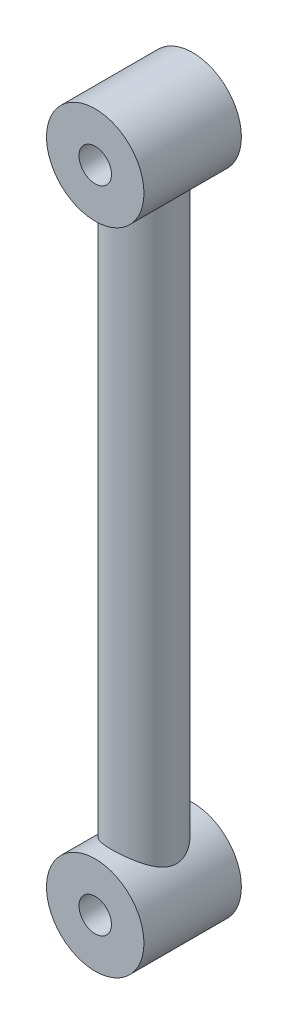
ISO-10303-21;
HEADER;
FILE_DESCRIPTION(('STEP AP214'),'2;1');
FILE_NAME('part.step','',(''),(''),'','','');
FILE_SCHEMA(('AUTOMOTIVE_DESIGN { 1 0 10303 214 1 1 1 1 }'));
ENDSEC;
DATA;
#1=APPLICATION_CONTEXT('core data for automotive mechanical design processes');
#2=APPLICATION_PROTOCOL_DEFINITION('international standard','automotive_design',2000,#1);
#3=PRODUCT_CONTEXT('',#1,'mechanical');
#4=PRODUCT('Part','Part','',(#3));
#5=PRODUCT_RELATED_PRODUCT_CATEGORY('part','',(#4));
#6=PRODUCT_DEFINITION_FORMATION('','',#4);
#7=PRODUCT_DEFINITION_CONTEXT('part definition',#1,'design');
#8=PRODUCT_DEFINITION('design','',#6,#7);
#9=PRODUCT_DEFINITION_SHAPE('','',#8);
#10=(LENGTH_UNIT() NAMED_UNIT(*) SI_UNIT(.MILLI.,.METRE.));
#11=(NAMED_UNIT(*) PLANE_ANGLE_UNIT() SI_UNIT($,.RADIAN.));
#12=(NAMED_UNIT(*) SI_UNIT($,.STERADIAN.) SOLID_ANGLE_UNIT());
#13=UNCERTAINTY_MEASURE_WITH_UNIT(LENGTH_MEASURE(1.E-05),#10,'distance_accuracy_value','');
#14=(GEOMETRIC_REPRESENTATION_CONTEXT(3) GLOBAL_UNCERTAINTY_ASSIGNED_CONTEXT((#13)) GLOBAL_UNIT_ASSIGNED_CONTEXT((#10,
#11,#12)) REPRESENTATION_CONTEXT('',''));
#15=CARTESIAN_POINT('',(0.,0.,0.));
#16=DIRECTION('',(0.,0.,1.));
#17=DIRECTION('',(1.,0.,0.));
#18=AXIS2_PLACEMENT_3D('',#15,#16,#17);
#19=CARTESIAN_POINT('',(0.,0.,3.));
#20=DIRECTION('',(0.,0.,1.));
#21=DIRECTION('',(1.,0.,0.));
#22=AXIS2_PLACEMENT_3D('',#19,#20,#21);
#23=PLANE('',#22);
#24=CARTESIAN_POINT('',(0.,0.,3.));
#25=DIRECTION('',(0.,0.,1.));
#26=DIRECTION('',(1.,0.,0.));
#27=AXIS2_PLACEMENT_3D('',#24,#25,#26);
#28=CIRCLE('',#27,1.5);
#29=CARTESIAN_POINT('',(1.5,0.,3.));
#30=VERTEX_POINT('',#29);
#31=EDGE_CURVE('E10',#30,#30,#28,.T.);
#32=ORIENTED_EDGE('',*,*,#31,.T.);
#33=EDGE_LOOP('',(#32));
#34=FACE_BOUND('',#33,.T.);
#35=CARTESIAN_POINT('',(0.,0.,3.));
#36=DIRECTION('',(0.,0.,1.));
#37=DIRECTION('',(1.,0.,0.));
#38=AXIS2_PLACEMENT_3D('',#35,#36,#37);
#39=CIRCLE('',#38,0.5);
#40=CARTESIAN_POINT('',(0.5,0.,3.));
#41=VERTEX_POINT('',#40);
#42=EDGE_CURVE('E42',#41,#41,#39,.T.);
#43=ORIENTED_EDGE('',*,*,#42,.F.);
#44=EDGE_LOOP('',(#43));
#45=FACE_BOUND('',#44,.T.);
#46=ADVANCED_FACE('F31',(#34,#45),#23,.T.);
#47=CARTESIAN_POINT('',(0.,0.,0.));
#48=DIRECTION('',(0.,0.,1.));
#49=DIRECTION('',(1.,0.,0.));
#50=AXIS2_PLACEMENT_3D('',#47,#48,#49);
#51=PLANE('',#50);
#52=CARTESIAN_POINT('',(0.,0.,0.));
#53=DIRECTION('',(0.,0.,1.));
#54=DIRECTION('',(1.,0.,0.));
#55=AXIS2_PLACEMENT_3D('',#52,#53,#54);
#56=CIRCLE('',#55,1.5);
#57=CARTESIAN_POINT('',(1.5,0.,0.));
#58=VERTEX_POINT('',#57);
#59=EDGE_CURVE('E35',#58,#58,#56,.T.);
#60=ORIENTED_EDGE('',*,*,#59,.F.);
#61=EDGE_LOOP('',(#60));
#62=FACE_BOUND('',#61,.T.);
#63=CARTESIAN_POINT('',(0.,0.,0.));
#64=DIRECTION('',(0.,0.,1.));
#65=DIRECTION('',(1.,0.,0.));
#66=AXIS2_PLACEMENT_3D('',#63,#64,#65);
#67=CIRCLE('',#66,0.5);
#68=CARTESIAN_POINT('',(0.5,0.,0.));
#69=VERTEX_POINT('',#68);
#70=EDGE_CURVE('E44',#69,#69,#67,.T.);
#71=ORIENTED_EDGE('',*,*,#70,.T.);
#72=EDGE_LOOP('',(#71));
#73=FACE_BOUND('',#72,.T.);
#74=ADVANCED_FACE('F89',(#62,#73),#51,.F.);
#75=CARTESIAN_POINT('',(0.,0.,3.));
#76=DIRECTION('',(0.,0.,-1.));
#77=DIRECTION('',(-1.,0.,0.));
#78=AXIS2_PLACEMENT_3D('',#75,#76,#77);
#79=CYLINDRICAL_SURFACE('',#78,1.5);
#80=CARTESIAN_POINT('',(0.,1.5,2.5));
#81=CARTESIAN_POINT('',(0.0502423583340652,1.50000020822414,2.50000027481625));
#82=CARTESIAN_POINT('',(0.100484543566459,1.49745401376693,2.49619301502225));
#83=CARTESIAN_POINT('',(0.199366529015835,1.48752326211906,2.48120156794717));
#84=CARTESIAN_POINT('',(0.248005556977503,1.48013640790618,2.47001387843835));
#85=CARTESIAN_POINT('',(0.342106153927127,1.46125241202354,2.44094614133758));
#86=CARTESIAN_POINT('',(0.387581436328779,1.44977452746657,2.42309742999603));
#87=CARTESIAN_POINT('',(0.47470764549863,1.4236306893872,2.38146831836425));
#88=CARTESIAN_POINT('',(0.516358015804835,1.40896427302755,2.35768705684972));
#89=CARTESIAN_POINT('',(0.598642350385056,1.37613664684919,2.30267153131628));
#90=CARTESIAN_POINT('',(0.638890152730339,1.3577844878966,2.27097606962855));
#91=CARTESIAN_POINT('',(0.71386402234637,1.31991156541733,2.20213497567077));
#92=CARTESIAN_POINT('',(0.74858202771944,1.30038915178416,2.16498153508113));
#93=CARTESIAN_POINT('',(0.817111488727482,1.25864132339397,2.07947381619366));
#94=CARTESIAN_POINT('',(0.849915931813756,1.23647533968899,2.03027717339828));
#95=CARTESIAN_POINT('',(0.906751785070869,1.19542073676408,1.92581831117673));
#96=CARTESIAN_POINT('',(0.930798367132496,1.17652647977327,1.87056679921861));
#97=CARTESIAN_POINT('',(0.963370175057205,1.14988133320735,1.7716443532892));
#98=CARTESIAN_POINT('',(0.974372236180083,1.14048813946218,1.72923577356309));
#99=CARTESIAN_POINT('',(0.990753088926101,1.12628984829786,1.64262774762913));
#100=CARTESIAN_POINT('',(0.996141573259662,1.12147684372013,1.59843152563681));
#101=CARTESIAN_POINT('',(1.00095682070629,1.11718302804083,1.50926261057193));
#102=CARTESIAN_POINT('',(1.0003592145882,1.11772401279478,1.4642874882744));
#103=CARTESIAN_POINT('',(0.993187906666196,1.12409887741485,1.37518251324952));
#104=CARTESIAN_POINT('',(0.986609141899785,1.12993724142592,1.33105340898368));
#105=CARTESIAN_POINT('',(0.968324971088713,1.14563592995791,1.24676647438121));
#106=CARTESIAN_POINT('',(0.956858557405004,1.15530744165153,1.20651933203847));
#107=CARTESIAN_POINT('',(0.929350592909502,1.17754811463845,1.12848815450425));
#108=CARTESIAN_POINT('',(0.913307536614356,1.19011822916388,1.09070493485137));
#109=CARTESIAN_POINT('',(0.87336909369832,1.21982098202212,1.01048730235886));
#110=CARTESIAN_POINT('',(0.848540261643843,1.23736158924507,0.968670049905941));
#111=CARTESIAN_POINT('',(0.79334480233653,1.27345768922483,0.889308302508095));
#112=CARTESIAN_POINT('',(0.762971345040339,1.29201441370946,0.851769171162871));
#113=CARTESIAN_POINT('',(0.689905826559712,1.33271671862095,0.773728727144433));
#114=CARTESIAN_POINT('',(0.6459696914045,1.35477372355024,0.734332975644298));
#115=CARTESIAN_POINT('',(0.55100399955381,1.39609050337857,0.663401752745065));
#116=CARTESIAN_POINT('',(0.499981149675164,1.41535288825285,0.631858927298954));
#117=CARTESIAN_POINT('',(0.402428913545602,1.44572702044166,0.583261140685796));
#118=CARTESIAN_POINT('',(0.356978821685242,1.45769630582498,0.564578318329789));
#119=CARTESIAN_POINT('',(0.263018021968455,1.47753859515521,0.533947537188057));
#120=CARTESIAN_POINT('',(0.214509939501019,1.48541506063844,0.52199388643409));
#121=CARTESIAN_POINT('',(0.115492726585948,1.49637941078331,0.505419417380803));
#122=CARTESIAN_POINT('',(0.0649759059670244,1.49944661230576,0.500830269530819));
#123=CARTESIAN_POINT('',(-0.036220759694616,1.50041557482591,0.499376455718946));
#124=CARTESIAN_POINT('',(-0.0869005930932811,1.49831769692815,0.502511249755611));
#125=CARTESIAN_POINT('',(-0.183227858602146,1.48949794712138,0.515812027780979));
#126=CARTESIAN_POINT('',(-0.228978722339654,1.48311123195135,0.525468648877662));
#127=CARTESIAN_POINT('',(-0.318058196213639,1.46659224642396,0.550797843006378));
#128=CARTESIAN_POINT('',(-0.361386418785354,1.45645937873408,0.5664713754639));
#129=CARTESIAN_POINT('',(-0.447332375233221,1.4324817626467,0.604326148522677));
#130=CARTESIAN_POINT('',(-0.489748092316563,1.41844935068245,0.626844077041761));
#131=CARTESIAN_POINT('',(-0.570341511977789,1.38800927805403,0.677216644972303));
#132=CARTESIAN_POINT('',(-0.608516574097254,1.37160015200651,0.705074580262964));
#133=CARTESIAN_POINT('',(-0.685927227415322,1.33477273328243,0.770303934082368));
#134=CARTESIAN_POINT('',(-0.724375937862664,1.31413078406203,0.808483130052021));
#135=CARTESIAN_POINT('',(-0.794669840332392,1.27285586536854,0.890555714964069));
#136=CARTESIAN_POINT('',(-0.826510468230432,1.25222291185946,0.934453019499398));
#137=CARTESIAN_POINT('',(-0.880623882794762,1.21469839506517,1.0235712064292));
#138=CARTESIAN_POINT('',(-0.903478180804393,1.19763798588662,1.06836601689986));
#139=CARTESIAN_POINT('',(-0.94248106887625,1.16719487207113,1.16193632639057));
#140=CARTESIAN_POINT('',(-0.958641728453857,1.1538055628277,1.21070446919769));
#141=CARTESIAN_POINT('',(-0.981179217293118,1.13466604076532,1.30228224356704));
#142=CARTESIAN_POINT('',(-0.988792987823091,1.12797499006895,1.34458590492947));
#143=CARTESIAN_POINT('',(-0.998496029624886,1.11939733222928,1.43028664066772));
#144=CARTESIAN_POINT('',(-1.00059130142516,1.11750550674066,1.47368247557323));
#145=CARTESIAN_POINT('',(-0.999119609907756,1.11882100574833,1.56032152835836));
#146=CARTESIAN_POINT('',(-0.995549293852655,1.12203134956834,1.60356464068146));
#147=CARTESIAN_POINT('',(-0.98298498610997,1.1330522619864,1.68867176427148));
#148=CARTESIAN_POINT('',(-0.973983758587649,1.14086896751217,1.73053385693038));
#149=CARTESIAN_POINT('',(-0.947965178356308,1.1626342196827,1.82285559321431));
#150=CARTESIAN_POINT('',(-0.929450935941993,1.17766166854602,1.87263385636953));
#151=CARTESIAN_POINT('',(-0.885422631474873,1.21111080629161,1.96774341708941));
#152=CARTESIAN_POINT('',(-0.85989874178542,1.22953724861883,2.01306834896843));
#153=CARTESIAN_POINT('',(-0.801991402694657,1.26808593269726,2.09964094359684));
#154=CARTESIAN_POINT('',(-0.769491549448272,1.2882329369107,2.14079937271925));
#155=CARTESIAN_POINT('',(-0.698358840177309,1.32814150773993,2.21766123912123));
#156=CARTESIAN_POINT('',(-0.659724105134951,1.3479029541764,2.2533629985124));
#157=CARTESIAN_POINT('',(-0.570728664877768,1.38815775980392,2.32335605215706));
#158=CARTESIAN_POINT('',(-0.519480834775987,1.40834902724558,2.35670932008983));
#159=CARTESIAN_POINT('',(-0.41043427788749,1.44388832937518,2.41395663833198));
#160=CARTESIAN_POINT('',(-0.352646031225023,1.45924396722731,2.43786555341182));
#161=CARTESIAN_POINT('',(-0.245717534917525,1.48050822418367,2.47057728908201));
#162=CARTESIAN_POINT('',(-0.197506162628867,1.48775740184446,2.48155551954934));
#163=CARTESIAN_POINT('',(-0.0995290060120646,1.49750140070948,2.49626401626902));
#164=CARTESIAN_POINT('',(-0.0497644180940277,1.49999979375663,2.499999727798));
#165=CARTESIAN_POINT('',(0.,1.5,2.5));
#166=B_SPLINE_CURVE_WITH_KNOTS('',3,(#80,#81,#82,#83,#84,#85,#86,#87,#88,#89,#90,#91,#92,#93,
#94,#95,#96,#97,#98,#99,#100,#101,#102,#103,#104,#105,#106,#107,#108,#109,#110,#111,#112,#113,
#114,#115,#116,#117,#118,#119,#120,#121,#122,#123,#124,#125,#126,#127,#128,#129,#130,#131,#132,
#133,#134,#135,#136,#137,#138,#139,#140,#141,#142,#143,#144,#145,#146,#147,#148,#149,#150,#151,
#152,#153,#154,#155,#156,#157,#158,#159,#160,#161,#162,#163,#164,#165),.UNSPECIFIED.,.T.,.F.,(4,
2,2,2,2,2,2,2,2,2,2,2,2,2,2,2,2,2,2,2,2,2,2,2,2,2,2,2,2,2,2,2,2,2,2,2,2,2,2,2,2,2,4),(0.,
0.1505266132527,0.301124707174344,0.451023076595116,0.600943219336933,0.763585145002784,
0.926462058021593,1.11503341647991,1.30327652722719,1.43716846838015,1.57082883922905,
1.70503355867689,1.83935198631676,1.96774431099011,2.09617891902539,2.25073787329797,
2.40548851889212,2.5935947724756,2.78152420149865,2.93262043847563,3.08358867570591,
3.23520441646309,3.38680955765891,3.5277654239542,3.66874377568319,3.81826173413942,
3.96787227471786,4.1411408806983,4.31452876587063,4.47324967649701,4.63168313315306,
4.76162024003012,4.8914160016149,5.02128860137218,5.15133461921144,5.31603304346011,
5.48096356682587,5.64889622595852,5.81688041978686,6.00897675773025,6.20076953274023,
6.34997645676983,6.49907115623394),.UNSPECIFIED.);
#167=CARTESIAN_POINT('',(0.,1.5,2.5));
#168=VERTEX_POINT('',#167);
#169=EDGE_CURVE('E47',#168,#168,#166,.T.);
#170=ORIENTED_EDGE('',*,*,#169,.F.);
#171=EDGE_LOOP('',(#170));
#172=FACE_BOUND('',#171,.T.);
#173=ORIENTED_EDGE('',*,*,#31,.F.);
#174=EDGE_LOOP('',(#173));
#175=FACE_BOUND('',#174,.T.);
#176=ORIENTED_EDGE('',*,*,#59,.T.);
#177=EDGE_LOOP('',(#176));
#178=FACE_BOUND('',#177,.T.);
#179=ADVANCED_FACE('F33',(#172,#175,#178),#79,.T.);
#180=CARTESIAN_POINT('',(0.,0.,3.));
#181=DIRECTION('',(0.,0.,-1.));
#182=DIRECTION('',(-1.,0.,0.));
#183=AXIS2_PLACEMENT_3D('',#180,#181,#182);
#184=CYLINDRICAL_SURFACE('',#183,0.5);
#185=ORIENTED_EDGE('',*,*,#42,.T.);
#186=EDGE_LOOP('',(#185));
#187=FACE_BOUND('',#186,.T.);
#188=ORIENTED_EDGE('',*,*,#70,.F.);
#189=EDGE_LOOP('',(#188));
#190=FACE_BOUND('',#189,.T.);
#191=ADVANCED_FACE('F96',(#187,#190),#184,.F.);
#192=CARTESIAN_POINT('',(0.,-1.501,1.5));
#193=DIRECTION('',(0.,1.,0.));
#194=DIRECTION('',(0.,0.,1.));
#195=AXIS2_PLACEMENT_3D('',#192,#193,#194);
#196=CYLINDRICAL_SURFACE('',#195,1.);
#197=ORIENTED_EDGE('',*,*,#169,.T.);
#198=EDGE_LOOP('',(#197));
#199=FACE_BOUND('',#198,.T.);
#200=CARTESIAN_POINT('',(1.,18.8819660112501,1.5));
#201=CARTESIAN_POINT('',(0.999997269988655,18.8819612326859,1.45118584456569));
#202=CARTESIAN_POINT('',(0.996394962518321,18.8787096447628,1.4023546231456));
#203=CARTESIAN_POINT('',(0.982291341588656,18.8663401374919,1.30644004417459));
#204=CARTESIAN_POINT('',(0.971777652939313,18.8572116959364,1.25935998223522));
#205=CARTESIAN_POINT('',(0.944679308383161,18.8347170708722,1.16863227906116));
#206=CARTESIAN_POINT('',(0.928153590071071,18.821392191027,1.12495615163117));
#207=CARTESIAN_POINT('',(0.889670041967693,18.7920795265909,1.04106708382667));
#208=CARTESIAN_POINT('',(0.867711084060815,18.7760911892058,1.00085486501176));
#209=CARTESIAN_POINT('',(0.81501205003857,18.7402696353399,0.918176556191546));
#210=CARTESIAN_POINT('',(0.783437177258663,18.7202253195482,0.876333941141402));
#211=CARTESIAN_POINT('',(0.714096098703402,18.6802758634596,0.79799864556286));
#212=CARTESIAN_POINT('',(0.676323865885403,18.6603708785101,0.761511239170737));
#213=CARTESIAN_POINT('',(0.589078452471479,18.6195559073813,0.689678170609168));
#214=CARTESIAN_POINT('',(0.538703219829097,18.5989160707654,0.655258744112164));
#215=CARTESIAN_POINT('',(0.431235482106117,18.5622075775862,0.595678952254963));
#216=CARTESIAN_POINT('',(0.374150576160853,18.5461338188448,0.570508242984405));
#217=CARTESIAN_POINT('',(0.261624536740002,18.5220004626764,0.533221799491273));
#218=CARTESIAN_POINT('',(0.206717362590708,18.5132441219207,0.51995832775222));
#219=CARTESIAN_POINT('',(0.0948477243649314,18.5019512726904,0.502907755358176));
#220=CARTESIAN_POINT('',(0.0378879406429131,18.4994069311882,0.499108720387279));
#221=CARTESIAN_POINT('',(-0.0670735251161643,18.5007231913852,0.501086224974525));
#222=CARTESIAN_POINT('',(-0.115120319004376,18.5036686754494,0.505494525658531));
#223=CARTESIAN_POINT('',(-0.209619316635507,18.5139590860499,0.521045525679454));
#224=CARTESIAN_POINT('',(-0.256071403824861,18.5213043334345,0.532188716151771));
#225=CARTESIAN_POINT('',(-0.346038968835584,18.5397395414813,0.560597842397288));
#226=CARTESIAN_POINT('',(-0.38956531192298,18.5508146100866,0.577839442599278));
#227=CARTESIAN_POINT('',(-0.473104575326777,18.5758944776186,0.617776821476409));
#228=CARTESIAN_POINT('',(-0.513116852484701,18.5898998112742,0.640473595750756));
#229=CARTESIAN_POINT('',(-0.59414214598172,18.6219097077465,0.693989368729946));
#230=CARTESIAN_POINT('',(-0.634595740498538,18.6401979560399,0.725483761676394));
#231=CARTESIAN_POINT('',(-0.709994037491522,18.677996990865,0.793949339740162));
#232=CARTESIAN_POINT('',(-0.744930067597284,18.6975096359238,0.830928972966907));
#233=CARTESIAN_POINT('',(-0.813861176630825,18.7392497752792,0.915981605106644));
#234=CARTESIAN_POINT('',(-0.846867965631775,18.7614283999553,0.964885539857239));
#235=CARTESIAN_POINT('',(-0.904174374727407,18.8026219458445,1.06875491961036));
#236=CARTESIAN_POINT('',(-0.928488593274469,18.8216421423256,1.12370999720697));
#237=CARTESIAN_POINT('',(-0.96166362283889,18.8486856484655,1.22235953103654));
#238=CARTESIAN_POINT('',(-0.972953958737703,18.8582981771115,1.26479668502839));
#239=CARTESIAN_POINT('',(-0.989897777900028,18.8729548010521,1.35151974490846));
#240=CARTESIAN_POINT('',(-0.995561034821824,18.8780068160888,1.39580230558646));
#241=CARTESIAN_POINT('',(-1.00089700074453,18.8827622150626,1.48522149322059));
#242=CARTESIAN_POINT('',(-1.00054364876605,18.8824423306655,1.53036098925948));
#243=CARTESIAN_POINT('',(-0.993808148581261,18.8764505981574,1.6198419169781));
#244=CARTESIAN_POINT('',(-0.987421113449805,18.8707744117639,1.66418267205586));
#245=CARTESIAN_POINT('',(-0.969499055937225,18.8553601124885,1.74869470877286));
#246=CARTESIAN_POINT('',(-0.958230872657145,18.8458340646228,1.78896385449378));
#247=CARTESIAN_POINT('',(-0.931115208135281,18.8238502073602,1.86706311803266));
#248=CARTESIAN_POINT('',(-0.915266188999617,18.8113914136327,1.9048924115095));
#249=CARTESIAN_POINT('',(-0.875816733031261,18.7819425818926,1.98510100188837));
#250=CARTESIAN_POINT('',(-0.851300144226029,18.7645445923118,2.02687840563095));
#251=CARTESIAN_POINT('',(-0.796763657645588,18.7286874254352,2.10620840116497));
#252=CARTESIAN_POINT('',(-0.766737059459378,18.7102269751069,2.14375575832942));
#253=CARTESIAN_POINT('',(-0.694383288512646,18.669621608584,2.22198117378524));
#254=CARTESIAN_POINT('',(-0.650801932557861,18.6475527393574,2.26155142413785));
#255=CARTESIAN_POINT('',(-0.556549744344254,18.6061220907416,2.33290834145647));
#256=CARTESIAN_POINT('',(-0.505885238731676,18.5867579260406,2.36470188562506));
#257=CARTESIAN_POINT('',(-0.408743737408331,18.5560458937987,2.41394586946146));
#258=CARTESIAN_POINT('',(-0.363331182442471,18.5438727094476,2.4329782522209));
#259=CARTESIAN_POINT('',(-0.269378539510943,18.5236064606622,2.46430359715951));
#260=CARTESIAN_POINT('',(-0.220841131929568,18.5155099506393,2.47660225142969));
#261=CARTESIAN_POINT('',(-0.121684696151535,18.504108179867,2.49384848191957));
#262=CARTESIAN_POINT('',(-0.0710574184621083,18.5008242457175,2.49876333975339));
#263=CARTESIAN_POINT('',(0.0304277732903178,18.4994508948545,2.5008239257085));
#264=CARTESIAN_POINT('',(0.0812856654767123,18.5013609953054,2.49797037597807));
#265=CARTESIAN_POINT('',(0.177878766264066,18.5098522201134,2.48517025549766));
#266=CARTESIAN_POINT('',(0.223717571535269,18.5160836139507,2.4757545075691));
#267=CARTESIAN_POINT('',(0.313009211498529,18.5323194689653,2.45088099528455));
#268=CARTESIAN_POINT('',(0.356461674343445,18.5423245162645,2.43542229232637));
#269=CARTESIAN_POINT('',(0.442573648304177,18.566041172569,2.39803064755799));
#270=CARTESIAN_POINT('',(0.485041794600134,18.5799337552683,2.37577484625246));
#271=CARTESIAN_POINT('',(0.565776331341592,18.6101229588226,2.32592467768701));
#272=CARTESIAN_POINT('',(0.60404018602501,18.6264210167737,2.298327116024));
#273=CARTESIAN_POINT('',(0.681647111007011,18.663035342638,2.23368554883184));
#274=CARTESIAN_POINT('',(0.720213397630457,18.6835804306132,2.19583848816298));
#275=CARTESIAN_POINT('',(0.790800111407979,18.7247332117526,2.11444322922708));
#276=CARTESIAN_POINT('',(0.822815641619617,18.7453409401492,2.07089080558295));
#277=CARTESIAN_POINT('',(0.877566267592056,18.7830789320485,1.98206620462235));
#278=CARTESIAN_POINT('',(0.900823234486051,18.8003545662905,1.93717909502483));
#279=CARTESIAN_POINT('',(0.940579011701363,18.8312624920449,1.84335777550342));
#280=CARTESIAN_POINT('',(0.957090951406666,18.8449018435235,1.79443165306892));
#281=CARTESIAN_POINT('',(0.97968131235454,18.8640447403523,1.70461426578773));
#282=CARTESIAN_POINT('',(0.987261141866243,18.8706815229492,1.66434588160485));
#283=CARTESIAN_POINT('',(0.997419579094631,18.87964240392,1.58272179974773));
#284=CARTESIAN_POINT('',(1.00000231351858,18.8819700607926,1.54136702786971));
#285=CARTESIAN_POINT('',(1.,18.8819660112501,1.5));
#286=B_SPLINE_CURVE_WITH_KNOTS('',3,(#200,#201,#202,#203,#204,#205,#206,#207,#208,#209,#210,
#211,#212,#213,#214,#215,#216,#217,#218,#219,#220,#221,#222,#223,#224,#225,#226,#227,#228,#229,
#230,#231,#232,#233,#234,#235,#236,#237,#238,#239,#240,#241,#242,#243,#244,#245,#246,#247,#248,
#249,#250,#251,#252,#253,#254,#255,#256,#257,#258,#259,#260,#261,#262,#263,#264,#265,#266,#267,
#268,#269,#270,#271,#272,#273,#274,#275,#276,#277,#278,#279,#280,#281,#282,#283,#284,#285),
.UNSPECIFIED.,.T.,.F.,(4,2,2,2,2,2,2,2,2,2,2,2,2,2,2,2,2,2,2,2,2,2,2,2,2,2,2,2,2,2,2,2,2,2,2,2,
2,2,2,2,2,2,4),(0.,0.146253465361076,0.292769521129643,0.437886325608136,0.583033286332743,
0.750773385343186,0.918677592181375,1.11083515503145,1.3027771469429,1.4731874103179,
1.64338268344149,1.78769767477871,1.93202319141873,2.07577915986595,2.219561384515,
2.38223762973317,2.54516707398319,2.73339351752472,2.92130234871974,3.05563045200662,
3.18972483117743,3.32440018819018,3.45918471785299,3.58738225853468,3.71562288822479,
3.86949615025543,4.0235577839993,4.21127342259657,4.39882245285466,4.55035290305024,
4.70175506443411,4.85382614632258,5.00588309222248,5.14688391124039,5.28790663945594,
5.43708931492125,5.58636147964719,5.75911103141433,5.93198925208477,6.09167062897535,
6.25103968323788,6.37508308151303,6.49902399831892),.UNSPECIFIED.);
#287=CARTESIAN_POINT('',(1.,18.8819660112501,1.5));
#288=VERTEX_POINT('',#287);
#289=EDGE_CURVE('E56',#288,#288,#286,.T.);
#290=ORIENTED_EDGE('',*,*,#289,.F.);
#291=EDGE_LOOP('',(#290));
#292=FACE_BOUND('',#291,.T.);
#293=ADVANCED_FACE('F62',(#199,#292),#196,.T.);
#294=CARTESIAN_POINT('',(0.,20.,3.));
#295=DIRECTION('',(0.,0.,-1.));
#296=DIRECTION('',(-1.,0.,0.));
#297=AXIS2_PLACEMENT_3D('',#294,#295,#296);
#298=CYLINDRICAL_SURFACE('',#297,1.5);
#299=ORIENTED_EDGE('',*,*,#289,.T.);
#300=EDGE_LOOP('',(#299));
#301=FACE_BOUND('',#300,.T.);
#302=CARTESIAN_POINT('',(0.,20.,3.));
#303=DIRECTION('',(0.,0.,-1.));
#304=DIRECTION('',(1.,0.,0.));
#305=AXIS2_PLACEMENT_3D('',#302,#303,#304);
#306=CIRCLE('',#305,1.5);
#307=CARTESIAN_POINT('',(1.5,20.,3.));
#308=VERTEX_POINT('',#307);
#309=EDGE_CURVE('E118',#308,#308,#306,.T.);
#310=ORIENTED_EDGE('',*,*,#309,.T.);
#311=EDGE_LOOP('',(#310));
#312=FACE_BOUND('',#311,.T.);
#313=CARTESIAN_POINT('',(0.,20.,0.));
#314=DIRECTION('',(0.,0.,-1.));
#315=DIRECTION('',(1.,0.,0.));
#316=AXIS2_PLACEMENT_3D('',#313,#314,#315);
#317=CIRCLE('',#316,1.5);
#318=CARTESIAN_POINT('',(1.5,20.,0.));
#319=VERTEX_POINT('',#318);
#320=EDGE_CURVE('E120',#319,#319,#317,.T.);
#321=ORIENTED_EDGE('',*,*,#320,.F.);
#322=EDGE_LOOP('',(#321));
#323=FACE_BOUND('',#322,.T.);
#324=ADVANCED_FACE('F69',(#301,#312,#323),#298,.T.);
#325=CARTESIAN_POINT('',(0.,20.,3.));
#326=DIRECTION('',(0.,0.,1.));
#327=DIRECTION('',(1.,0.,0.));
#328=AXIS2_PLACEMENT_3D('',#325,#326,#327);
#329=PLANE('',#328);
#330=CARTESIAN_POINT('',(0.,20.,3.));
#331=DIRECTION('',(0.,0.,-1.));
#332=DIRECTION('',(1.,0.,0.));
#333=AXIS2_PLACEMENT_3D('',#330,#331,#332);
#334=CIRCLE('',#333,0.5);
#335=CARTESIAN_POINT('',(0.5,20.,3.));
#336=VERTEX_POINT('',#335);
#337=EDGE_CURVE('E125',#336,#336,#334,.T.);
#338=ORIENTED_EDGE('',*,*,#337,.T.);
#339=EDGE_LOOP('',(#338));
#340=FACE_BOUND('',#339,.T.);
#341=ORIENTED_EDGE('',*,*,#309,.F.);
#342=EDGE_LOOP('',(#341));
#343=FACE_BOUND('',#342,.T.);
#344=ADVANCED_FACE('F72',(#340,#343),#329,.T.);
#345=CARTESIAN_POINT('',(0.,20.,0.));
#346=DIRECTION('',(0.,0.,1.));
#347=DIRECTION('',(1.,0.,0.));
#348=AXIS2_PLACEMENT_3D('',#345,#346,#347);
#349=PLANE('',#348);
#350=CARTESIAN_POINT('',(0.,20.,0.));
#351=DIRECTION('',(0.,0.,-1.));
#352=DIRECTION('',(1.,0.,0.));
#353=AXIS2_PLACEMENT_3D('',#350,#351,#352);
#354=CIRCLE('',#353,0.5);
#355=CARTESIAN_POINT('',(0.5,20.,0.));
#356=VERTEX_POINT('',#355);
#357=EDGE_CURVE('E127',#356,#356,#354,.T.);
#358=ORIENTED_EDGE('',*,*,#357,.F.);
#359=EDGE_LOOP('',(#358));
#360=FACE_BOUND('',#359,.T.);
#361=ORIENTED_EDGE('',*,*,#320,.T.);
#362=EDGE_LOOP('',(#361));
#363=FACE_BOUND('',#362,.T.);
#364=ADVANCED_FACE('F74',(#360,#363),#349,.F.);
#365=CARTESIAN_POINT('',(0.,20.,3.));
#366=DIRECTION('',(0.,0.,-1.));
#367=DIRECTION('',(-1.,0.,0.));
#368=AXIS2_PLACEMENT_3D('',#365,#366,#367);
#369=CYLINDRICAL_SURFACE('',#368,0.5);
#370=ORIENTED_EDGE('',*,*,#337,.F.);
#371=EDGE_LOOP('',(#370));
#372=FACE_BOUND('',#371,.T.);
#373=ORIENTED_EDGE('',*,*,#357,.T.);
#374=EDGE_LOOP('',(#373));
#375=FACE_BOUND('',#374,.T.);
#376=ADVANCED_FACE('F77',(#372,#375),#369,.F.);
#377=CLOSED_SHELL('',(#46,#74,#179,#191,#293,#324,#344,#364,#376));
#378=MANIFOLD_SOLID_BREP('B2',#377);
#379=ADVANCED_BREP_SHAPE_REPRESENTATION('',(#18,#378),#14);
#380=SHAPE_DEFINITION_REPRESENTATION(#9,#379);
ENDSEC;
END-ISO-10303-21;
